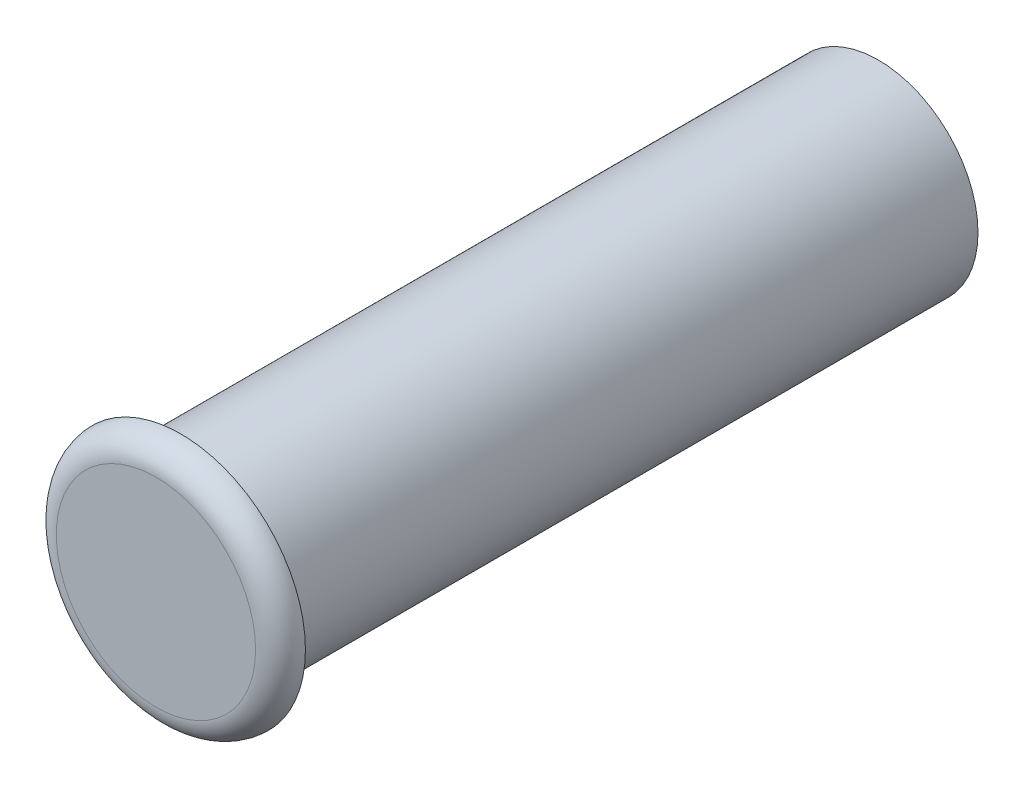
ISO-10303-21;
HEADER;
FILE_DESCRIPTION(('STEP AP214'),'2;1');
FILE_NAME('part.step','',(''),(''),'','','');
FILE_SCHEMA(('AUTOMOTIVE_DESIGN { 1 0 10303 214 1 1 1 1 }'));
ENDSEC;
DATA;
#1=APPLICATION_CONTEXT('core data for automotive mechanical design processes');
#2=APPLICATION_PROTOCOL_DEFINITION('international standard','automotive_design',2000,#1);
#3=PRODUCT_CONTEXT('',#1,'mechanical');
#4=PRODUCT('Part','Part','',(#3));
#5=PRODUCT_RELATED_PRODUCT_CATEGORY('part','',(#4));
#6=PRODUCT_DEFINITION_FORMATION('','',#4);
#7=PRODUCT_DEFINITION_CONTEXT('part definition',#1,'design');
#8=PRODUCT_DEFINITION('design','',#6,#7);
#9=PRODUCT_DEFINITION_SHAPE('','',#8);
#10=(LENGTH_UNIT() NAMED_UNIT(*) SI_UNIT(.MILLI.,.METRE.));
#11=(NAMED_UNIT(*) PLANE_ANGLE_UNIT() SI_UNIT($,.RADIAN.));
#12=(NAMED_UNIT(*) SI_UNIT($,.STERADIAN.) SOLID_ANGLE_UNIT());
#13=UNCERTAINTY_MEASURE_WITH_UNIT(LENGTH_MEASURE(1.E-05),#10,'distance_accuracy_value','');
#14=(GEOMETRIC_REPRESENTATION_CONTEXT(3) GLOBAL_UNCERTAINTY_ASSIGNED_CONTEXT((#13)) GLOBAL_UNIT_ASSIGNED_CONTEXT((#10,
#11,#12)) REPRESENTATION_CONTEXT('',''));
#15=CARTESIAN_POINT('',(0.,0.,0.));
#16=DIRECTION('',(0.,0.,1.));
#17=DIRECTION('',(1.,0.,0.));
#18=AXIS2_PLACEMENT_3D('',#15,#16,#17);
#19=CARTESIAN_POINT('',(0.,0.,7.));
#20=DIRECTION('',(0.,0.,-1.));
#21=DIRECTION('',(-1.,0.,0.));
#22=AXIS2_PLACEMENT_3D('',#19,#20,#21);
#23=CYLINDRICAL_SURFACE('',#22,2.);
#24=CARTESIAN_POINT('',(0.,0.,7.));
#25=DIRECTION('',(0.,0.,1.));
#26=DIRECTION('',(1.,0.,0.));
#27=AXIS2_PLACEMENT_3D('',#24,#25,#26);
#28=CIRCLE('',#27,2.);
#29=CARTESIAN_POINT('',(2.,0.,7.));
#30=VERTEX_POINT('',#29);
#31=EDGE_CURVE('E45',#30,#30,#28,.T.);
#32=ORIENTED_EDGE('',*,*,#31,.F.);
#33=EDGE_LOOP('',(#32));
#34=FACE_BOUND('',#33,.T.);
#35=CARTESIAN_POINT('',(0.,0.,-7.));
#36=DIRECTION('',(0.,0.,1.));
#37=DIRECTION('',(1.,0.,0.));
#38=AXIS2_PLACEMENT_3D('',#35,#36,#37);
#39=CIRCLE('',#38,2.);
#40=CARTESIAN_POINT('',(2.,0.,-7.));
#41=VERTEX_POINT('',#40);
#42=EDGE_CURVE('E50',#41,#41,#39,.T.);
#43=ORIENTED_EDGE('',*,*,#42,.T.);
#44=EDGE_LOOP('',(#43));
#45=FACE_BOUND('',#44,.T.);
#46=ADVANCED_FACE('F37',(#34,#45),#23,.T.);
#47=CARTESIAN_POINT('',(0.,0.,-7.));
#48=DIRECTION('',(0.,0.,1.));
#49=DIRECTION('',(1.,0.,0.));
#50=AXIS2_PLACEMENT_3D('',#47,#48,#49);
#51=PLANE('',#50);
#52=CARTESIAN_POINT('',(0.,0.,-7.));
#53=DIRECTION('',(0.,0.,-1.));
#54=DIRECTION('',(-1.,0.,0.));
#55=AXIS2_PLACEMENT_3D('',#52,#53,#54);
#56=CIRCLE('',#55,1.5);
#57=CARTESIAN_POINT('',(-1.5,0.,-7.));
#58=VERTEX_POINT('',#57);
#59=EDGE_CURVE('E62',#58,#58,#56,.T.);
#60=ORIENTED_EDGE('',*,*,#59,.F.);
#61=EDGE_LOOP('',(#60));
#62=FACE_BOUND('',#61,.T.);
#63=ORIENTED_EDGE('',*,*,#42,.F.);
#64=EDGE_LOOP('',(#63));
#65=FACE_BOUND('',#64,.T.);
#66=ADVANCED_FACE('F78',(#62,#65),#51,.F.);
#67=CARTESIAN_POINT('',(0.,0.,7.5));
#68=DIRECTION('',(0.,0.,1.));
#69=DIRECTION('',(1.,0.,0.));
#70=AXIS2_PLACEMENT_3D('',#67,#68,#69);
#71=PLANE('',#70);
#72=CARTESIAN_POINT('',(0.,0.,7.5));
#73=DIRECTION('',(0.,0.,1.));
#74=DIRECTION('',(1.,0.,0.));
#75=AXIS2_PLACEMENT_3D('',#72,#73,#74);
#76=CIRCLE('',#75,2.);
#77=CARTESIAN_POINT('',(2.,0.,7.5));
#78=VERTEX_POINT('',#77);
#79=EDGE_CURVE('E10',#78,#78,#76,.T.);
#80=ORIENTED_EDGE('',*,*,#79,.T.);
#81=EDGE_LOOP('',(#80));
#82=FACE_BOUND('',#81,.T.);
#83=ADVANCED_FACE('F81',(#82),#71,.T.);
#84=CARTESIAN_POINT('',(0.,0.,7.));
#85=DIRECTION('',(0.,0.,1.));
#86=DIRECTION('',(1.,0.,0.));
#87=AXIS2_PLACEMENT_3D('',#84,#85,#86);
#88=PLANE('',#87);
#89=ORIENTED_EDGE('',*,*,#31,.T.);
#90=EDGE_LOOP('',(#89));
#91=FACE_BOUND('',#90,.T.);
#92=CARTESIAN_POINT('',(0.,0.,7.));
#93=DIRECTION('',(0.,0.,1.));
#94=DIRECTION('',(1.,0.,0.));
#95=AXIS2_PLACEMENT_3D('',#92,#93,#94);
#96=CIRCLE('',#95,2.5);
#97=CARTESIAN_POINT('',(2.5,0.,7.));
#98=VERTEX_POINT('',#97);
#99=EDGE_CURVE('E56',#98,#98,#96,.T.);
#100=ORIENTED_EDGE('',*,*,#99,.F.);
#101=EDGE_LOOP('',(#100));
#102=FACE_BOUND('',#101,.T.);
#103=ADVANCED_FACE('F90',(#91,#102),#88,.F.);
#104=CARTESIAN_POINT('',(0.,0.,7.));
#105=DIRECTION('',(0.,0.,1.));
#106=DIRECTION('',(1.,0.,0.));
#107=AXIS2_PLACEMENT_3D('',#104,#105,#106);
#108=TOROIDAL_SURFACE('',#107,2.,0.5);
#109=ORIENTED_EDGE('',*,*,#99,.T.);
#110=EDGE_LOOP('',(#109));
#111=FACE_BOUND('',#110,.T.);
#112=ORIENTED_EDGE('',*,*,#79,.F.);
#113=EDGE_LOOP('',(#112));
#114=FACE_BOUND('',#113,.T.);
#115=ADVANCED_FACE('F39',(#111,#114),#108,.T.);
#116=CARTESIAN_POINT('',(0.,0.,7.));
#117=DIRECTION('',(0.,0.,-1.));
#118=DIRECTION('',(-1.,0.,0.));
#119=AXIS2_PLACEMENT_3D('',#116,#117,#118);
#120=CYLINDRICAL_SURFACE('',#119,1.5);
#121=CARTESIAN_POINT('',(0.,0.,7.));
#122=DIRECTION('',(0.,0.,-1.));
#123=DIRECTION('',(-1.,0.,0.));
#124=AXIS2_PLACEMENT_3D('',#121,#122,#123);
#125=CIRCLE('',#124,1.5);
#126=CARTESIAN_POINT('',(-1.5,0.,7.));
#127=VERTEX_POINT('',#126);
#128=EDGE_CURVE('E61',#127,#127,#125,.T.);
#129=ORIENTED_EDGE('',*,*,#128,.F.);
#130=EDGE_LOOP('',(#129));
#131=FACE_BOUND('',#130,.T.);
#132=ORIENTED_EDGE('',*,*,#59,.T.);
#133=EDGE_LOOP('',(#132));
#134=FACE_BOUND('',#133,.T.);
#135=ADVANCED_FACE('F72',(#131,#134),#120,.F.);
#136=CARTESIAN_POINT('',(0.,0.,7.));
#137=DIRECTION('',(0.,0.,-1.));
#138=DIRECTION('',(-1.,0.,0.));
#139=AXIS2_PLACEMENT_3D('',#136,#137,#138);
#140=PLANE('',#139);
#141=ORIENTED_EDGE('',*,*,#128,.T.);
#142=EDGE_LOOP('',(#141));
#143=FACE_BOUND('',#142,.T.);
#144=ADVANCED_FACE('F70',(#143),#140,.T.);
#145=CLOSED_SHELL('',(#46,#66,#83,#103,#115,#135,#144));
#146=MANIFOLD_SOLID_BREP('B2',#145);
#147=ADVANCED_BREP_SHAPE_REPRESENTATION('',(#18,#146),#14);
#148=SHAPE_DEFINITION_REPRESENTATION(#9,#147);
ENDSEC;
END-ISO-10303-21;
